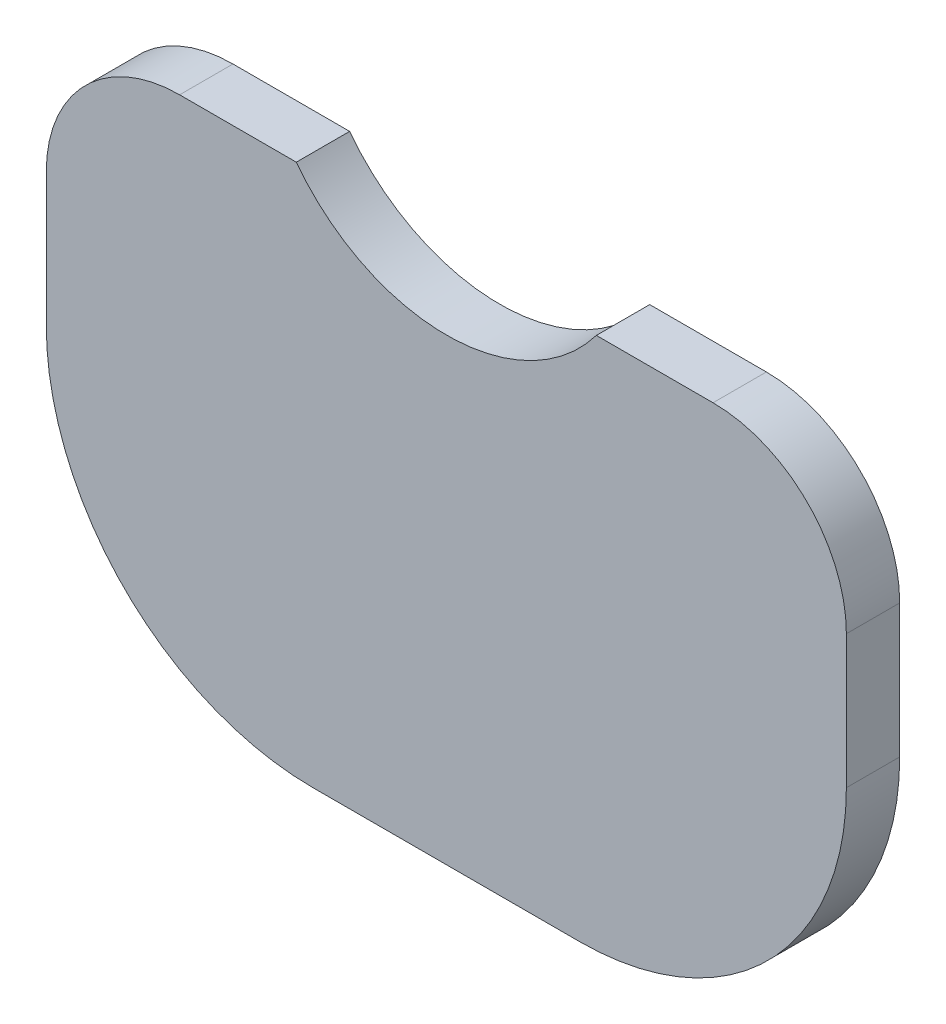
ISO-10303-21;
HEADER;
FILE_DESCRIPTION(('STEP AP214'),'2;1');
FILE_NAME('part.step','',(''),(''),'','','');
FILE_SCHEMA(('AUTOMOTIVE_DESIGN { 1 0 10303 214 1 1 1 1 }'));
ENDSEC;
DATA;
#1=APPLICATION_CONTEXT('core data for automotive mechanical design processes');
#2=APPLICATION_PROTOCOL_DEFINITION('international standard','automotive_design',2000,#1);
#3=PRODUCT_CONTEXT('',#1,'mechanical');
#4=PRODUCT('Part','Part','',(#3));
#5=PRODUCT_RELATED_PRODUCT_CATEGORY('part','',(#4));
#6=PRODUCT_DEFINITION_FORMATION('','',#4);
#7=PRODUCT_DEFINITION_CONTEXT('part definition',#1,'design');
#8=PRODUCT_DEFINITION('design','',#6,#7);
#9=PRODUCT_DEFINITION_SHAPE('','',#8);
#10=(LENGTH_UNIT() NAMED_UNIT(*) SI_UNIT(.MILLI.,.METRE.));
#11=(NAMED_UNIT(*) PLANE_ANGLE_UNIT() SI_UNIT($,.RADIAN.));
#12=(NAMED_UNIT(*) SI_UNIT($,.STERADIAN.) SOLID_ANGLE_UNIT());
#13=UNCERTAINTY_MEASURE_WITH_UNIT(LENGTH_MEASURE(1.E-05),#10,'distance_accuracy_value','');
#14=(GEOMETRIC_REPRESENTATION_CONTEXT(3) GLOBAL_UNCERTAINTY_ASSIGNED_CONTEXT((#13)) GLOBAL_UNIT_ASSIGNED_CONTEXT((#10,
#11,#12)) REPRESENTATION_CONTEXT('',''));
#15=CARTESIAN_POINT('',(0.,0.,0.));
#16=DIRECTION('',(0.,0.,1.));
#17=DIRECTION('',(1.,0.,0.));
#18=AXIS2_PLACEMENT_3D('',#15,#16,#17);
#19=CARTESIAN_POINT('',(-10.,0.,4.));
#20=DIRECTION('',(0.,0.,-1.));
#21=DIRECTION('',(-1.,0.,0.));
#22=AXIS2_PLACEMENT_3D('',#19,#20,#21);
#23=CYLINDRICAL_SURFACE('',#22,20.);
#24=CARTESIAN_POINT('',(-10.,0.,0.));
#25=DIRECTION('',(0.,0.,1.));
#26=DIRECTION('',(1.,0.,0.));
#27=AXIS2_PLACEMENT_3D('',#24,#25,#26);
#28=CIRCLE('',#27,20.);
#29=CARTESIAN_POINT('',(-9.99999999999986,-20.,0.));
#30=VERTEX_POINT('',#29);
#31=CARTESIAN_POINT('',(-30.,1.35308431126191E-13,0.));
#32=VERTEX_POINT('',#31);
#33=EDGE_CURVE('E155',#30,#32,#28,.F.);
#34=ORIENTED_EDGE('',*,*,#33,.F.);
#35=DIRECTION('',(0.,0.,-1.));
#36=VECTOR('',#35,1.);
#37=CARTESIAN_POINT('',(-9.99999999999986,-20.,4.));
#38=LINE('',#37,#36);
#39=CARTESIAN_POINT('',(-9.99999999999986,-20.,4.));
#40=VERTEX_POINT('',#39);
#41=EDGE_CURVE('E11',#40,#30,#38,.T.);
#42=ORIENTED_EDGE('',*,*,#41,.F.);
#43=CARTESIAN_POINT('',(-10.,0.,4.));
#44=DIRECTION('',(0.,0.,1.));
#45=DIRECTION('',(1.,0.,0.));
#46=AXIS2_PLACEMENT_3D('',#43,#44,#45);
#47=CIRCLE('',#46,20.);
#48=CARTESIAN_POINT('',(-30.,1.35308431126191E-13,4.));
#49=VERTEX_POINT('',#48);
#50=EDGE_CURVE('E188',#40,#49,#47,.F.);
#51=ORIENTED_EDGE('',*,*,#50,.T.);
#52=DIRECTION('',(0.,0.,-1.));
#53=VECTOR('',#52,1.);
#54=CARTESIAN_POINT('',(-30.,1.35308431126191E-13,4.));
#55=LINE('',#54,#53);
#56=EDGE_CURVE('E62',#49,#32,#55,.T.);
#57=ORIENTED_EDGE('',*,*,#56,.T.);
#58=EDGE_LOOP('',(#34,#42,#51,#57));
#59=FACE_BOUND('',#58,.T.);
#60=ADVANCED_FACE('F45',(#59),#23,.T.);
#61=CARTESIAN_POINT('',(0.,-20.,4.));
#62=DIRECTION('',(0.,-1.,0.));
#63=DIRECTION('',(1.,0.,0.));
#64=AXIS2_PLACEMENT_3D('',#61,#62,#63);
#65=PLANE('',#64);
#66=DIRECTION('',(-1.,0.,0.));
#67=VECTOR('',#66,1.);
#68=CARTESIAN_POINT('',(0.,-20.,0.));
#69=LINE('',#68,#67);
#70=CARTESIAN_POINT('',(9.99999999999986,-20.,0.));
#71=VERTEX_POINT('',#70);
#72=EDGE_CURVE('E158',#71,#30,#69,.T.);
#73=ORIENTED_EDGE('',*,*,#72,.F.);
#74=DIRECTION('',(0.,0.,-1.));
#75=VECTOR('',#74,1.);
#76=CARTESIAN_POINT('',(9.99999999999986,-20.,4.));
#77=LINE('',#76,#75);
#78=CARTESIAN_POINT('',(9.99999999999986,-20.,4.));
#79=VERTEX_POINT('',#78);
#80=EDGE_CURVE('E54',#79,#71,#77,.T.);
#81=ORIENTED_EDGE('',*,*,#80,.F.);
#82=DIRECTION('',(-1.,0.,0.));
#83=VECTOR('',#82,1.);
#84=CARTESIAN_POINT('',(0.,-20.,4.));
#85=LINE('',#84,#83);
#86=EDGE_CURVE('E244',#79,#40,#85,.T.);
#87=ORIENTED_EDGE('',*,*,#86,.T.);
#88=ORIENTED_EDGE('',*,*,#41,.T.);
#89=EDGE_LOOP('',(#73,#81,#87,#88));
#90=FACE_BOUND('',#89,.T.);
#91=ADVANCED_FACE('F219',(#90),#65,.T.);
#92=CARTESIAN_POINT('',(10.,0.,4.));
#93=DIRECTION('',(0.,0.,-1.));
#94=DIRECTION('',(-1.,0.,0.));
#95=AXIS2_PLACEMENT_3D('',#92,#93,#94);
#96=CYLINDRICAL_SURFACE('',#95,20.);
#97=CARTESIAN_POINT('',(10.,0.,0.));
#98=DIRECTION('',(0.,0.,1.));
#99=DIRECTION('',(1.,0.,0.));
#100=AXIS2_PLACEMENT_3D('',#97,#98,#99);
#101=CIRCLE('',#100,20.);
#102=CARTESIAN_POINT('',(30.,1.38777878078145E-13,0.));
#103=VERTEX_POINT('',#102);
#104=EDGE_CURVE('E163',#103,#71,#101,.F.);
#105=ORIENTED_EDGE('',*,*,#104,.F.);
#106=DIRECTION('',(0.,0.,-1.));
#107=VECTOR('',#106,1.);
#108=CARTESIAN_POINT('',(30.,1.38777878078145E-13,4.));
#109=LINE('',#108,#107);
#110=CARTESIAN_POINT('',(30.,1.38777878078145E-13,4.));
#111=VERTEX_POINT('',#110);
#112=EDGE_CURVE('E206',#111,#103,#109,.T.);
#113=ORIENTED_EDGE('',*,*,#112,.F.);
#114=CARTESIAN_POINT('',(10.,0.,4.));
#115=DIRECTION('',(0.,0.,1.));
#116=DIRECTION('',(1.,0.,0.));
#117=AXIS2_PLACEMENT_3D('',#114,#115,#116);
#118=CIRCLE('',#117,20.);
#119=EDGE_CURVE('E215',#111,#79,#118,.F.);
#120=ORIENTED_EDGE('',*,*,#119,.T.);
#121=ORIENTED_EDGE('',*,*,#80,.T.);
#122=EDGE_LOOP('',(#105,#113,#120,#121));
#123=FACE_BOUND('',#122,.T.);
#124=ADVANCED_FACE('F213',(#123),#96,.T.);
#125=CARTESIAN_POINT('',(30.,0.,4.));
#126=DIRECTION('',(-1.,0.,0.));
#127=DIRECTION('',(0.,0.,1.));
#128=AXIS2_PLACEMENT_3D('',#125,#126,#127);
#129=PLANE('',#128);
#130=DIRECTION('',(0.,1.,0.));
#131=VECTOR('',#130,1.);
#132=CARTESIAN_POINT('',(30.,0.,0.));
#133=LINE('',#132,#131);
#134=CARTESIAN_POINT('',(30.,9.99999999999993,0.));
#135=VERTEX_POINT('',#134);
#136=EDGE_CURVE('E167',#103,#135,#133,.T.);
#137=ORIENTED_EDGE('',*,*,#136,.T.);
#138=DIRECTION('',(0.,0.,-1.));
#139=VECTOR('',#138,1.);
#140=CARTESIAN_POINT('',(30.,9.99999999999993,4.));
#141=LINE('',#140,#139);
#142=CARTESIAN_POINT('',(30.,9.99999999999993,4.));
#143=VERTEX_POINT('',#142);
#144=EDGE_CURVE('E202',#143,#135,#141,.T.);
#145=ORIENTED_EDGE('',*,*,#144,.F.);
#146=DIRECTION('',(0.,1.,0.));
#147=VECTOR('',#146,1.);
#148=CARTESIAN_POINT('',(30.,0.,4.));
#149=LINE('',#148,#147);
#150=EDGE_CURVE('E236',#111,#143,#149,.T.);
#151=ORIENTED_EDGE('',*,*,#150,.F.);
#152=ORIENTED_EDGE('',*,*,#112,.T.);
#153=EDGE_LOOP('',(#137,#145,#151,#152));
#154=FACE_BOUND('',#153,.T.);
#155=ADVANCED_FACE('F227',(#154),#129,.F.);
#156=CARTESIAN_POINT('',(20.,10.,4.));
#157=DIRECTION('',(0.,0.,-1.));
#158=DIRECTION('',(-1.,0.,0.));
#159=AXIS2_PLACEMENT_3D('',#156,#157,#158);
#160=CYLINDRICAL_SURFACE('',#159,10.);
#161=CARTESIAN_POINT('',(20.,10.,0.));
#162=DIRECTION('',(0.,0.,1.));
#163=DIRECTION('',(1.,0.,0.));
#164=AXIS2_PLACEMENT_3D('',#161,#162,#163);
#165=CIRCLE('',#164,10.);
#166=CARTESIAN_POINT('',(19.9999999999999,20.,0.));
#167=VERTEX_POINT('',#166);
#168=EDGE_CURVE('E170',#135,#167,#165,.T.);
#169=ORIENTED_EDGE('',*,*,#168,.T.);
#170=DIRECTION('',(0.,0.,-1.));
#171=VECTOR('',#170,1.);
#172=CARTESIAN_POINT('',(19.9999999999999,20.,4.));
#173=LINE('',#172,#171);
#174=CARTESIAN_POINT('',(19.9999999999999,20.,4.));
#175=VERTEX_POINT('',#174);
#176=EDGE_CURVE('E198',#175,#167,#173,.T.);
#177=ORIENTED_EDGE('',*,*,#176,.F.);
#178=CARTESIAN_POINT('',(20.,10.,4.));
#179=DIRECTION('',(0.,0.,1.));
#180=DIRECTION('',(1.,0.,0.));
#181=AXIS2_PLACEMENT_3D('',#178,#179,#180);
#182=CIRCLE('',#181,10.);
#183=EDGE_CURVE('E233',#143,#175,#182,.T.);
#184=ORIENTED_EDGE('',*,*,#183,.F.);
#185=ORIENTED_EDGE('',*,*,#144,.T.);
#186=EDGE_LOOP('',(#169,#177,#184,#185));
#187=FACE_BOUND('',#186,.T.);
#188=ADVANCED_FACE('F231',(#187),#160,.T.);
#189=CARTESIAN_POINT('',(0.,20.,4.));
#190=DIRECTION('',(0.,-1.,0.));
#191=DIRECTION('',(1.,0.,0.));
#192=AXIS2_PLACEMENT_3D('',#189,#190,#191);
#193=PLANE('',#192);
#194=DIRECTION('',(-1.,0.,0.));
#195=VECTOR('',#194,1.);
#196=CARTESIAN_POINT('',(0.,20.,0.));
#197=LINE('',#196,#195);
#198=CARTESIAN_POINT('',(11.2498888883402,20.,0.));
#199=VERTEX_POINT('',#198);
#200=EDGE_CURVE('E173',#167,#199,#197,.T.);
#201=ORIENTED_EDGE('',*,*,#200,.T.);
#202=DIRECTION('',(0.,0.,-1.));
#203=VECTOR('',#202,1.);
#204=CARTESIAN_POINT('',(11.2498888883402,20.,4.));
#205=LINE('',#204,#203);
#206=CARTESIAN_POINT('',(11.2498888883402,20.,4.));
#207=VERTEX_POINT('',#206);
#208=EDGE_CURVE('E195',#207,#199,#205,.T.);
#209=ORIENTED_EDGE('',*,*,#208,.F.);
#210=DIRECTION('',(-1.,0.,0.));
#211=VECTOR('',#210,1.);
#212=CARTESIAN_POINT('',(0.,20.,4.));
#213=LINE('',#212,#211);
#214=EDGE_CURVE('E136',#175,#207,#213,.T.);
#215=ORIENTED_EDGE('',*,*,#214,.F.);
#216=ORIENTED_EDGE('',*,*,#176,.T.);
#217=EDGE_LOOP('',(#201,#209,#215,#216));
#218=FACE_BOUND('',#217,.T.);
#219=ADVANCED_FACE('F300',(#218),#193,.F.);
#220=CARTESIAN_POINT('',(0.,28.5,4.));
#221=DIRECTION('',(0.,0.,-1.));
#222=DIRECTION('',(-1.,0.,0.));
#223=AXIS2_PLACEMENT_3D('',#220,#221,#222);
#224=CYLINDRICAL_SURFACE('',#223,14.1);
#225=CARTESIAN_POINT('',(0.,28.5,0.));
#226=DIRECTION('',(0.,0.,1.));
#227=DIRECTION('',(1.,0.,0.));
#228=AXIS2_PLACEMENT_3D('',#225,#226,#227);
#229=CIRCLE('',#228,14.1);
#230=CARTESIAN_POINT('',(-11.2498888883402,20.,0.));
#231=VERTEX_POINT('',#230);
#232=EDGE_CURVE('E177',#231,#199,#229,.T.);
#233=ORIENTED_EDGE('',*,*,#232,.F.);
#234=DIRECTION('',(0.,0.,-1.));
#235=VECTOR('',#234,1.);
#236=CARTESIAN_POINT('',(-11.2498888883402,20.,4.));
#237=LINE('',#236,#235);
#238=CARTESIAN_POINT('',(-11.2498888883402,20.,4.));
#239=VERTEX_POINT('',#238);
#240=EDGE_CURVE('E145',#239,#231,#237,.T.);
#241=ORIENTED_EDGE('',*,*,#240,.F.);
#242=CARTESIAN_POINT('',(0.,28.5,4.));
#243=DIRECTION('',(0.,0.,1.));
#244=DIRECTION('',(1.,0.,0.));
#245=AXIS2_PLACEMENT_3D('',#242,#243,#244);
#246=CIRCLE('',#245,14.1);
#247=EDGE_CURVE('E132',#239,#207,#246,.T.);
#248=ORIENTED_EDGE('',*,*,#247,.T.);
#249=ORIENTED_EDGE('',*,*,#208,.T.);
#250=EDGE_LOOP('',(#233,#241,#248,#249));
#251=FACE_BOUND('',#250,.T.);
#252=ADVANCED_FACE('F299',(#251),#224,.F.);
#253=CARTESIAN_POINT('',(-19.9999999999999,20.,0.));
#254=VERTEX_POINT('',#253);
#255=EDGE_CURVE('E141',#231,#254,#197,.T.);
#256=ORIENTED_EDGE('',*,*,#255,.T.);
#257=DIRECTION('',(0.,0.,-1.));
#258=VECTOR('',#257,1.);
#259=CARTESIAN_POINT('',(-19.9999999999999,20.,4.));
#260=LINE('',#259,#258);
#261=CARTESIAN_POINT('',(-19.9999999999999,20.,4.));
#262=VERTEX_POINT('',#261);
#263=EDGE_CURVE('E138',#262,#254,#260,.T.);
#264=ORIENTED_EDGE('',*,*,#263,.F.);
#265=EDGE_CURVE('E125',#239,#262,#213,.T.);
#266=ORIENTED_EDGE('',*,*,#265,.F.);
#267=ORIENTED_EDGE('',*,*,#240,.T.);
#268=EDGE_LOOP('',(#256,#264,#266,#267));
#269=FACE_BOUND('',#268,.T.);
#270=ADVANCED_FACE('F139',(#269),#193,.F.);
#271=CARTESIAN_POINT('',(-20.,9.99999999999999,4.));
#272=DIRECTION('',(0.,0.,-1.));
#273=DIRECTION('',(-1.,0.,0.));
#274=AXIS2_PLACEMENT_3D('',#271,#272,#273);
#275=CYLINDRICAL_SURFACE('',#274,10.);
#276=CARTESIAN_POINT('',(-20.,9.99999999999999,0.));
#277=DIRECTION('',(0.,0.,1.));
#278=DIRECTION('',(1.,0.,0.));
#279=AXIS2_PLACEMENT_3D('',#276,#277,#278);
#280=CIRCLE('',#279,10.);
#281=CARTESIAN_POINT('',(-30.,9.99999999999992,0.));
#282=VERTEX_POINT('',#281);
#283=EDGE_CURVE('E181',#282,#254,#280,.F.);
#284=ORIENTED_EDGE('',*,*,#283,.F.);
#285=DIRECTION('',(0.,0.,-1.));
#286=VECTOR('',#285,1.);
#287=CARTESIAN_POINT('',(-30.,9.99999999999992,4.));
#288=LINE('',#287,#286);
#289=CARTESIAN_POINT('',(-30.,9.99999999999992,4.));
#290=VERTEX_POINT('',#289);
#291=EDGE_CURVE('E93',#290,#282,#288,.T.);
#292=ORIENTED_EDGE('',*,*,#291,.F.);
#293=CARTESIAN_POINT('',(-20.,9.99999999999999,4.));
#294=DIRECTION('',(0.,0.,1.));
#295=DIRECTION('',(1.,0.,0.));
#296=AXIS2_PLACEMENT_3D('',#293,#294,#295);
#297=CIRCLE('',#296,10.);
#298=EDGE_CURVE('E130',#290,#262,#297,.F.);
#299=ORIENTED_EDGE('',*,*,#298,.T.);
#300=ORIENTED_EDGE('',*,*,#263,.T.);
#301=EDGE_LOOP('',(#284,#292,#299,#300));
#302=FACE_BOUND('',#301,.T.);
#303=ADVANCED_FACE('F147',(#302),#275,.T.);
#304=CARTESIAN_POINT('',(-30.,0.,4.));
#305=DIRECTION('',(-1.,0.,0.));
#306=DIRECTION('',(0.,0.,1.));
#307=AXIS2_PLACEMENT_3D('',#304,#305,#306);
#308=PLANE('',#307);
#309=DIRECTION('',(0.,1.,0.));
#310=VECTOR('',#309,1.);
#311=CARTESIAN_POINT('',(-30.,0.,0.));
#312=LINE('',#311,#310);
#313=EDGE_CURVE('E184',#32,#282,#312,.T.);
#314=ORIENTED_EDGE('',*,*,#313,.F.);
#315=ORIENTED_EDGE('',*,*,#56,.F.);
#316=DIRECTION('',(0.,1.,0.));
#317=VECTOR('',#316,1.);
#318=CARTESIAN_POINT('',(-30.,0.,4.));
#319=LINE('',#318,#317);
#320=EDGE_CURVE('E149',#49,#290,#319,.T.);
#321=ORIENTED_EDGE('',*,*,#320,.T.);
#322=ORIENTED_EDGE('',*,*,#291,.T.);
#323=EDGE_LOOP('',(#314,#315,#321,#322));
#324=FACE_BOUND('',#323,.T.);
#325=ADVANCED_FACE('F286',(#324),#308,.T.);
#326=CARTESIAN_POINT('',(0.,0.,4.));
#327=DIRECTION('',(0.,0.,1.));
#328=DIRECTION('',(1.,0.,0.));
#329=AXIS2_PLACEMENT_3D('',#326,#327,#328);
#330=PLANE('',#329);
#331=ORIENTED_EDGE('',*,*,#50,.F.);
#332=ORIENTED_EDGE('',*,*,#86,.F.);
#333=ORIENTED_EDGE('',*,*,#119,.F.);
#334=ORIENTED_EDGE('',*,*,#150,.T.);
#335=ORIENTED_EDGE('',*,*,#183,.T.);
#336=ORIENTED_EDGE('',*,*,#214,.T.);
#337=ORIENTED_EDGE('',*,*,#247,.F.);
#338=ORIENTED_EDGE('',*,*,#265,.T.);
#339=ORIENTED_EDGE('',*,*,#298,.F.);
#340=ORIENTED_EDGE('',*,*,#320,.F.);
#341=EDGE_LOOP('',(#331,#332,#333,#334,#335,#336,#337,#338,#339,#340));
#342=FACE_BOUND('',#341,.T.);
#343=ADVANCED_FACE('F127',(#342),#330,.T.);
#344=CARTESIAN_POINT('',(0.,0.,0.));
#345=DIRECTION('',(0.,0.,1.));
#346=DIRECTION('',(1.,0.,0.));
#347=AXIS2_PLACEMENT_3D('',#344,#345,#346);
#348=PLANE('',#347);
#349=CARTESIAN_POINT('',(12.5,0.,0.));
#350=DIRECTION('',(0.,0.,1.));
#351=DIRECTION('',(1.,0.,0.));
#352=AXIS2_PLACEMENT_3D('',#349,#350,#351);
#353=CIRCLE('',#352,7.5);
#354=CARTESIAN_POINT('',(20.,0.,0.));
#355=VERTEX_POINT('',#354);
#356=EDGE_CURVE('E253',#355,#355,#353,.T.);
#357=ORIENTED_EDGE('',*,*,#356,.T.);
#358=EDGE_LOOP('',(#357));
#359=FACE_BOUND('',#358,.T.);
#360=CARTESIAN_POINT('',(-12.5,0.,0.));
#361=DIRECTION('',(0.,0.,1.));
#362=DIRECTION('',(1.,0.,0.));
#363=AXIS2_PLACEMENT_3D('',#360,#361,#362);
#364=CIRCLE('',#363,7.5);
#365=CARTESIAN_POINT('',(-5.,0.,0.));
#366=VERTEX_POINT('',#365);
#367=EDGE_CURVE('E249',#366,#366,#364,.T.);
#368=ORIENTED_EDGE('',*,*,#367,.T.);
#369=EDGE_LOOP('',(#368));
#370=FACE_BOUND('',#369,.T.);
#371=ORIENTED_EDGE('',*,*,#33,.T.);
#372=ORIENTED_EDGE('',*,*,#313,.T.);
#373=ORIENTED_EDGE('',*,*,#283,.T.);
#374=ORIENTED_EDGE('',*,*,#255,.F.);
#375=ORIENTED_EDGE('',*,*,#232,.T.);
#376=ORIENTED_EDGE('',*,*,#200,.F.);
#377=ORIENTED_EDGE('',*,*,#168,.F.);
#378=ORIENTED_EDGE('',*,*,#136,.F.);
#379=ORIENTED_EDGE('',*,*,#104,.T.);
#380=ORIENTED_EDGE('',*,*,#72,.T.);
#381=EDGE_LOOP('',(#371,#372,#373,#374,#375,#376,#377,#378,#379,#380));
#382=FACE_BOUND('',#381,.T.);
#383=ADVANCED_FACE('F222',(#359,#370,#382),#348,.F.);
#384=CARTESIAN_POINT('',(-12.5,0.,-6.5));
#385=DIRECTION('',(0.,0.,1.));
#386=DIRECTION('',(1.,0.,0.));
#387=AXIS2_PLACEMENT_3D('',#384,#385,#386);
#388=CYLINDRICAL_SURFACE('',#387,7.5);
#389=CARTESIAN_POINT('',(-12.5,0.,-6.5));
#390=DIRECTION('',(0.,0.,1.));
#391=DIRECTION('',(1.,0.,0.));
#392=AXIS2_PLACEMENT_3D('',#389,#390,#391);
#393=CIRCLE('',#392,7.5);
#394=CARTESIAN_POINT('',(-5.,0.,-6.5));
#395=VERTEX_POINT('',#394);
#396=EDGE_CURVE('E159',#395,#395,#393,.T.);
#397=CARTESIAN_POINT('',(-5.,0.,-6.5));
#398=CARTESIAN_POINT('',(-5.,0.,-6.43229166666667));
#399=CARTESIAN_POINT('',(-5.,0.,-6.36458333333333));
#400=CARTESIAN_POINT('',(-5.,0.,-6.22916666666667));
#401=CARTESIAN_POINT('',(-5.,0.,-6.16145833333333));
#402=CARTESIAN_POINT('',(-5.,0.,-6.02604166666667));
#403=CARTESIAN_POINT('',(-5.,0.,-5.95833333333333));
#404=CARTESIAN_POINT('',(-5.,0.,-5.82291666666667));
#405=CARTESIAN_POINT('',(-5.,0.,-5.75520833333333));
#406=CARTESIAN_POINT('',(-5.,0.,-5.61979166666667));
#407=CARTESIAN_POINT('',(-5.,0.,-5.55208333333333));
#408=CARTESIAN_POINT('',(-5.,0.,-5.41666666666667));
#409=CARTESIAN_POINT('',(-5.,0.,-5.34895833333333));
#410=CARTESIAN_POINT('',(-5.,0.,-5.21354166666667));
#411=CARTESIAN_POINT('',(-5.,0.,-5.14583333333333));
#412=CARTESIAN_POINT('',(-5.,0.,-5.01041666666667));
#413=CARTESIAN_POINT('',(-5.,0.,-4.94270833333333));
#414=CARTESIAN_POINT('',(-5.,0.,-4.80729166666667));
#415=CARTESIAN_POINT('',(-5.,0.,-4.73958333333333));
#416=CARTESIAN_POINT('',(-5.,0.,-4.60416666666667));
#417=CARTESIAN_POINT('',(-5.,0.,-4.53645833333333));
#418=CARTESIAN_POINT('',(-5.,0.,-4.40104166666667));
#419=CARTESIAN_POINT('',(-5.,0.,-4.33333333333333));
#420=CARTESIAN_POINT('',(-5.,0.,-4.19791666666667));
#421=CARTESIAN_POINT('',(-5.,0.,-4.13020833333333));
#422=CARTESIAN_POINT('',(-5.,0.,-3.99479166666667));
#423=CARTESIAN_POINT('',(-5.,0.,-3.92708333333333));
#424=CARTESIAN_POINT('',(-5.,0.,-3.79166666666667));
#425=CARTESIAN_POINT('',(-5.,0.,-3.72395833333333));
#426=CARTESIAN_POINT('',(-5.,0.,-3.58854166666667));
#427=CARTESIAN_POINT('',(-5.,0.,-3.52083333333333));
#428=CARTESIAN_POINT('',(-5.,0.,-3.38541666666667));
#429=CARTESIAN_POINT('',(-5.,0.,-3.31770833333333));
#430=CARTESIAN_POINT('',(-5.,0.,-3.18229166666667));
#431=CARTESIAN_POINT('',(-5.,0.,-3.11458333333333));
#432=CARTESIAN_POINT('',(-5.,0.,-2.97916666666667));
#433=CARTESIAN_POINT('',(-5.,0.,-2.91145833333333));
#434=CARTESIAN_POINT('',(-5.,0.,-2.77604166666667));
#435=CARTESIAN_POINT('',(-5.,0.,-2.70833333333333));
#436=CARTESIAN_POINT('',(-5.,0.,-2.57291666666667));
#437=CARTESIAN_POINT('',(-5.,0.,-2.50520833333333));
#438=CARTESIAN_POINT('',(-5.,0.,-2.36979166666667));
#439=CARTESIAN_POINT('',(-5.,0.,-2.30208333333333));
#440=CARTESIAN_POINT('',(-5.,0.,-2.16666666666667));
#441=CARTESIAN_POINT('',(-5.,0.,-2.09895833333333));
#442=CARTESIAN_POINT('',(-5.,0.,-1.96354166666667));
#443=CARTESIAN_POINT('',(-5.,0.,-1.89583333333333));
#444=CARTESIAN_POINT('',(-5.,0.,-1.76041666666667));
#445=CARTESIAN_POINT('',(-5.,0.,-1.69270833333333));
#446=CARTESIAN_POINT('',(-5.,0.,-1.55729166666667));
#447=CARTESIAN_POINT('',(-5.,0.,-1.48958333333333));
#448=CARTESIAN_POINT('',(-5.,0.,-1.35416666666667));
#449=CARTESIAN_POINT('',(-5.,0.,-1.28645833333333));
#450=CARTESIAN_POINT('',(-5.,0.,-1.15104166666667));
#451=CARTESIAN_POINT('',(-5.,0.,-1.08333333333333));
#452=CARTESIAN_POINT('',(-5.,0.,-0.947916666666667));
#453=CARTESIAN_POINT('',(-5.,0.,-0.880208333333333));
#454=CARTESIAN_POINT('',(-5.,0.,-0.744791666666667));
#455=CARTESIAN_POINT('',(-5.,0.,-0.677083333333333));
#456=CARTESIAN_POINT('',(-5.,0.,-0.541666666666667));
#457=CARTESIAN_POINT('',(-5.,0.,-0.473958333333333));
#458=CARTESIAN_POINT('',(-5.,0.,-0.338541666666667));
#459=CARTESIAN_POINT('',(-5.,0.,-0.270833333333334));
#460=CARTESIAN_POINT('',(-5.,0.,-0.135416666666667));
#461=CARTESIAN_POINT('',(-5.,0.,-0.0677083333333334));
#462=CARTESIAN_POINT('',(-5.,0.,0.));
#463=B_SPLINE_CURVE_WITH_KNOTS('',3,(#397,#398,#399,#400,#401,#402,#403,#404,#405,#406,#407,
#408,#409,#410,#411,#412,#413,#414,#415,#416,#417,#418,#419,#420,#421,#422,#423,#424,#425,#426,
#427,#428,#429,#430,#431,#432,#433,#434,#435,#436,#437,#438,#439,#440,#441,#442,#443,#444,#445,
#446,#447,#448,#449,#450,#451,#452,#453,#454,#455,#456,#457,#458,#459,#460,#461,#462),
.UNSPECIFIED.,.F.,.F.,(4,2,2,2,2,2,2,2,2,2,2,2,2,2,2,2,2,2,2,2,2,2,2,2,2,2,2,2,2,2,2,2,4),(0.,
0.203124999999999,0.40625,0.609375,0.8125,1.015625,1.21875,1.421875,1.625,1.828125,2.03125,
2.234375,2.4375,2.640625,2.84375,3.046875,3.25,3.453125,3.65625,3.859375,4.0625,4.265625,
4.46875,4.671875,4.875,5.078125,5.28125,5.484375,5.6875,5.890625,6.09375,6.296875,6.5),.UNSPECIFIED.);
#464=EDGE_CURVE('BSEAM279',#395,#366,#463,.T.);
#465=ORIENTED_EDGE('',*,*,#396,.T.);
#466=ORIENTED_EDGE('',*,*,#367,.F.);
#467=ORIENTED_EDGE('',*,*,#464,.T.);
#468=ORIENTED_EDGE('',*,*,#464,.F.);
#469=EDGE_LOOP('',(#465,#467,#466,#468));
#470=FACE_BOUND('',#469,.T.);
#471=ADVANCED_FACE('F279',(#470),#388,.T.);
#472=CARTESIAN_POINT('',(-12.5,0.,-6.5));
#473=DIRECTION('',(0.,0.,1.));
#474=DIRECTION('',(1.,0.,0.));
#475=AXIS2_PLACEMENT_3D('',#472,#473,#474);
#476=PLANE('',#475);
#477=ORIENTED_EDGE('',*,*,#396,.F.);
#478=EDGE_LOOP('',(#477));
#479=FACE_BOUND('',#478,.T.);
#480=ADVANCED_FACE('F270',(#479),#476,.F.);
#481=CARTESIAN_POINT('',(12.5,0.,-6.5));
#482=DIRECTION('',(0.,0.,1.));
#483=DIRECTION('',(1.,0.,0.));
#484=AXIS2_PLACEMENT_3D('',#481,#482,#483);
#485=CYLINDRICAL_SURFACE('',#484,7.5);
#486=CARTESIAN_POINT('',(12.5,0.,-6.5));
#487=DIRECTION('',(0.,0.,1.));
#488=DIRECTION('',(1.,0.,0.));
#489=AXIS2_PLACEMENT_3D('',#486,#487,#488);
#490=CIRCLE('',#489,7.5);
#491=CARTESIAN_POINT('',(20.,0.,-6.5));
#492=VERTEX_POINT('',#491);
#493=EDGE_CURVE('E257',#492,#492,#490,.T.);
#494=CARTESIAN_POINT('',(20.,0.,-6.5));
#495=CARTESIAN_POINT('',(20.,0.,-6.43229166666667));
#496=CARTESIAN_POINT('',(20.,0.,-6.36458333333333));
#497=CARTESIAN_POINT('',(20.,0.,-6.22916666666667));
#498=CARTESIAN_POINT('',(20.,0.,-6.16145833333333));
#499=CARTESIAN_POINT('',(20.,0.,-6.02604166666667));
#500=CARTESIAN_POINT('',(20.,0.,-5.95833333333333));
#501=CARTESIAN_POINT('',(20.,0.,-5.82291666666667));
#502=CARTESIAN_POINT('',(20.,0.,-5.75520833333333));
#503=CARTESIAN_POINT('',(20.,0.,-5.61979166666667));
#504=CARTESIAN_POINT('',(20.,0.,-5.55208333333333));
#505=CARTESIAN_POINT('',(20.,0.,-5.41666666666667));
#506=CARTESIAN_POINT('',(20.,0.,-5.34895833333333));
#507=CARTESIAN_POINT('',(20.,0.,-5.21354166666667));
#508=CARTESIAN_POINT('',(20.,0.,-5.14583333333333));
#509=CARTESIAN_POINT('',(20.,0.,-5.01041666666667));
#510=CARTESIAN_POINT('',(20.,0.,-4.94270833333333));
#511=CARTESIAN_POINT('',(20.,0.,-4.80729166666667));
#512=CARTESIAN_POINT('',(20.,0.,-4.73958333333333));
#513=CARTESIAN_POINT('',(20.,0.,-4.60416666666667));
#514=CARTESIAN_POINT('',(20.,0.,-4.53645833333333));
#515=CARTESIAN_POINT('',(20.,0.,-4.40104166666667));
#516=CARTESIAN_POINT('',(20.,0.,-4.33333333333333));
#517=CARTESIAN_POINT('',(20.,0.,-4.19791666666667));
#518=CARTESIAN_POINT('',(20.,0.,-4.13020833333333));
#519=CARTESIAN_POINT('',(20.,0.,-3.99479166666667));
#520=CARTESIAN_POINT('',(20.,0.,-3.92708333333333));
#521=CARTESIAN_POINT('',(20.,0.,-3.79166666666667));
#522=CARTESIAN_POINT('',(20.,0.,-3.72395833333333));
#523=CARTESIAN_POINT('',(20.,0.,-3.58854166666667));
#524=CARTESIAN_POINT('',(20.,0.,-3.52083333333333));
#525=CARTESIAN_POINT('',(20.,0.,-3.38541666666667));
#526=CARTESIAN_POINT('',(20.,0.,-3.31770833333333));
#527=CARTESIAN_POINT('',(20.,0.,-3.18229166666667));
#528=CARTESIAN_POINT('',(20.,0.,-3.11458333333333));
#529=CARTESIAN_POINT('',(20.,0.,-2.97916666666667));
#530=CARTESIAN_POINT('',(20.,0.,-2.91145833333333));
#531=CARTESIAN_POINT('',(20.,0.,-2.77604166666667));
#532=CARTESIAN_POINT('',(20.,0.,-2.70833333333333));
#533=CARTESIAN_POINT('',(20.,0.,-2.57291666666667));
#534=CARTESIAN_POINT('',(20.,0.,-2.50520833333333));
#535=CARTESIAN_POINT('',(20.,0.,-2.36979166666667));
#536=CARTESIAN_POINT('',(20.,0.,-2.30208333333333));
#537=CARTESIAN_POINT('',(20.,0.,-2.16666666666667));
#538=CARTESIAN_POINT('',(20.,0.,-2.09895833333333));
#539=CARTESIAN_POINT('',(20.,0.,-1.96354166666667));
#540=CARTESIAN_POINT('',(20.,0.,-1.89583333333333));
#541=CARTESIAN_POINT('',(20.,0.,-1.76041666666667));
#542=CARTESIAN_POINT('',(20.,0.,-1.69270833333333));
#543=CARTESIAN_POINT('',(20.,0.,-1.55729166666667));
#544=CARTESIAN_POINT('',(20.,0.,-1.48958333333333));
#545=CARTESIAN_POINT('',(20.,0.,-1.35416666666667));
#546=CARTESIAN_POINT('',(20.,0.,-1.28645833333333));
#547=CARTESIAN_POINT('',(20.,0.,-1.15104166666667));
#548=CARTESIAN_POINT('',(20.,0.,-1.08333333333333));
#549=CARTESIAN_POINT('',(20.,0.,-0.947916666666667));
#550=CARTESIAN_POINT('',(20.,0.,-0.880208333333333));
#551=CARTESIAN_POINT('',(20.,0.,-0.744791666666667));
#552=CARTESIAN_POINT('',(20.,0.,-0.677083333333333));
#553=CARTESIAN_POINT('',(20.,0.,-0.541666666666667));
#554=CARTESIAN_POINT('',(20.,0.,-0.473958333333333));
#555=CARTESIAN_POINT('',(20.,0.,-0.338541666666667));
#556=CARTESIAN_POINT('',(20.,0.,-0.270833333333334));
#557=CARTESIAN_POINT('',(20.,0.,-0.135416666666667));
#558=CARTESIAN_POINT('',(20.,0.,-0.0677083333333334));
#559=CARTESIAN_POINT('',(20.,0.,0.));
#560=B_SPLINE_CURVE_WITH_KNOTS('',3,(#494,#495,#496,#497,#498,#499,#500,#501,#502,#503,#504,
#505,#506,#507,#508,#509,#510,#511,#512,#513,#514,#515,#516,#517,#518,#519,#520,#521,#522,#523,
#524,#525,#526,#527,#528,#529,#530,#531,#532,#533,#534,#535,#536,#537,#538,#539,#540,#541,#542,
#543,#544,#545,#546,#547,#548,#549,#550,#551,#552,#553,#554,#555,#556,#557,#558,#559),
.UNSPECIFIED.,.F.,.F.,(4,2,2,2,2,2,2,2,2,2,2,2,2,2,2,2,2,2,2,2,2,2,2,2,2,2,2,2,2,2,2,2,4),(0.,
0.203124999999999,0.40625,0.609375,0.8125,1.015625,1.21875,1.421875,1.625,1.828125,2.03125,
2.234375,2.4375,2.640625,2.84375,3.046875,3.25,3.453125,3.65625,3.859375,4.0625,4.265625,
4.46875,4.671875,4.875,5.078125,5.28125,5.484375,5.6875,5.890625,6.09375,6.296875,6.5),.UNSPECIFIED.);
#561=EDGE_CURVE('BSEAM267',#492,#355,#560,.T.);
#562=ORIENTED_EDGE('',*,*,#493,.T.);
#563=ORIENTED_EDGE('',*,*,#356,.F.);
#564=ORIENTED_EDGE('',*,*,#561,.T.);
#565=ORIENTED_EDGE('',*,*,#561,.F.);
#566=EDGE_LOOP('',(#562,#564,#563,#565));
#567=FACE_BOUND('',#566,.T.);
#568=ADVANCED_FACE('F267',(#567),#485,.T.);
#569=CARTESIAN_POINT('',(12.5,0.,-6.5));
#570=DIRECTION('',(0.,0.,1.));
#571=DIRECTION('',(1.,0.,0.));
#572=AXIS2_PLACEMENT_3D('',#569,#570,#571);
#573=PLANE('',#572);
#574=ORIENTED_EDGE('',*,*,#493,.F.);
#575=EDGE_LOOP('',(#574));
#576=FACE_BOUND('',#575,.T.);
#577=ADVANCED_FACE('F269',(#576),#573,.F.);
#578=CLOSED_SHELL('',(#60,#91,#124,#155,#188,#219,#252,#270,#303,#325,#343,#383,#471,#480,#568,#577));
#579=MANIFOLD_SOLID_BREP('B2',#578);
#580=ADVANCED_BREP_SHAPE_REPRESENTATION('',(#18,#579),#14);
#581=SHAPE_DEFINITION_REPRESENTATION(#9,#580);
ENDSEC;
END-ISO-10303-21;
